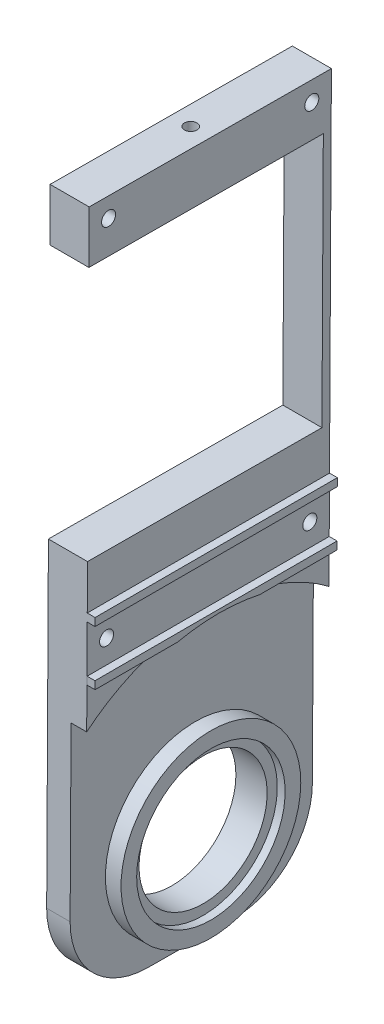
ISO-10303-21;
HEADER;
FILE_DESCRIPTION(('STEP AP214'),'2;1');
FILE_NAME('part.step','',(''),(''),'','','');
FILE_SCHEMA(('AUTOMOTIVE_DESIGN { 1 0 10303 214 1 1 1 1 }'));
ENDSEC;
DATA;
#1=APPLICATION_CONTEXT('core data for automotive mechanical design processes');
#2=APPLICATION_PROTOCOL_DEFINITION('international standard','automotive_design',2000,#1);
#3=PRODUCT_CONTEXT('',#1,'mechanical');
#4=PRODUCT('Part','Part','',(#3));
#5=PRODUCT_RELATED_PRODUCT_CATEGORY('part','',(#4));
#6=PRODUCT_DEFINITION_FORMATION('','',#4);
#7=PRODUCT_DEFINITION_CONTEXT('part definition',#1,'design');
#8=PRODUCT_DEFINITION('design','',#6,#7);
#9=PRODUCT_DEFINITION_SHAPE('','',#8);
#10=(LENGTH_UNIT() NAMED_UNIT(*) SI_UNIT(.MILLI.,.METRE.));
#11=(NAMED_UNIT(*) PLANE_ANGLE_UNIT() SI_UNIT($,.RADIAN.));
#12=(NAMED_UNIT(*) SI_UNIT($,.STERADIAN.) SOLID_ANGLE_UNIT());
#13=UNCERTAINTY_MEASURE_WITH_UNIT(LENGTH_MEASURE(1.E-05),#10,'distance_accuracy_value','');
#14=(GEOMETRIC_REPRESENTATION_CONTEXT(3) GLOBAL_UNCERTAINTY_ASSIGNED_CONTEXT((#13)) GLOBAL_UNIT_ASSIGNED_CONTEXT((#10,
#11,#12)) REPRESENTATION_CONTEXT('',''));
#15=CARTESIAN_POINT('',(0.,0.,0.));
#16=DIRECTION('',(0.,0.,1.));
#17=DIRECTION('',(1.,0.,0.));
#18=AXIS2_PLACEMENT_3D('',#15,#16,#17);
#19=CARTESIAN_POINT('',(-39.4500003051732,-115.077694337789,2.56996746609196));
#20=DIRECTION('',(1.,0.,0.));
#21=DIRECTION('',(0.,-0.00544923737853215,-0.999985152795776));
#22=AXIS2_PLACEMENT_3D('',#19,#20,#21);
#23=PLANE('',#22);
#24=DIRECTION('',(0.,-0.999985152795776,0.00544923737853215));
#25=VECTOR('',#24,1.);
#26=CARTESIAN_POINT('',(-39.4500003051732,-169.486724480372,1.86644474152904));
#27=LINE('',#26,#25);
#28=CARTESIAN_POINT('',(-39.4500003051732,-122.794382024896,1.61200330598548));
#29=VERTEX_POINT('',#28);
#30=CARTESIAN_POINT('',(-39.4500003051732,-127.316414004726,1.63664529754157));
#31=VERTEX_POINT('',#30);
#32=EDGE_CURVE('E336',#29,#31,#27,.T.);
#33=ORIENTED_EDGE('',*,*,#32,.F.);
#34=DIRECTION('',(0.,0.,-1.));
#35=VECTOR('',#34,1.);
#36=CARTESIAN_POINT('',(-39.4500003051732,-122.794382024896,0.));
#37=LINE('',#36,#35);
#38=CARTESIAN_POINT('',(-39.4500003051732,-122.794382024896,11.4836041956586));
#39=VERTEX_POINT('',#38);
#40=EDGE_CURVE('E215',#39,#29,#37,.T.);
#41=ORIENTED_EDGE('',*,*,#40,.F.);
#42=CARTESIAN_POINT('',(-39.4500003051732,-147.234378499964,16.7454073370512));
#43=DIRECTION('',(1.,0.,0.));
#44=DIRECTION('',(0.,-0.00544923737853215,-0.999985152795776));
#45=AXIS2_PLACEMENT_3D('',#42,#43,#44);
#46=CIRCLE('',#45,25.0000000000014);
#47=EDGE_CURVE('E361',#31,#39,#46,.T.);
#48=ORIENTED_EDGE('',*,*,#47,.F.);
#49=EDGE_LOOP('',(#33,#41,#48));
#50=FACE_BOUND('',#49,.T.);
#51=ADVANCED_FACE('F35',(#50),#23,.T.);
#52=CARTESIAN_POINT('',(-39.4500003051732,-72.4284713160586,29.8379665793882));
#53=DIRECTION('',(1.,0.,0.));
#54=DIRECTION('',(0.,-0.00544923737853215,-0.999985152795776));
#55=AXIS2_PLACEMENT_3D('',#52,#53,#54);
#56=CIRCLE('',#55,0.899999999999998);
#57=CARTESIAN_POINT('',(-39.4500003051732,-72.4333756296993,28.937979941872));
#58=VERTEX_POINT('',#57);
#59=EDGE_CURVE('E394',#58,#58,#56,.F.);
#60=ORIENTED_EDGE('',*,*,#59,.T.);
#61=EDGE_LOOP('',(#60));
#62=FACE_BOUND('',#61,.T.);
#63=CARTESIAN_POINT('',(-39.4500003051732,-72.5701514879004,3.838352606698));
#64=DIRECTION('',(1.,0.,0.));
#65=DIRECTION('',(0.,-0.00544923737853215,-0.999985152795776));
#66=AXIS2_PLACEMENT_3D('',#63,#64,#65);
#67=CIRCLE('',#66,0.899999999999998);
#68=CARTESIAN_POINT('',(-39.4500003051732,-72.5750558015411,2.93836596918181));
#69=VERTEX_POINT('',#68);
#70=EDGE_CURVE('E260',#69,#69,#67,.F.);
#71=ORIENTED_EDGE('',*,*,#70,.T.);
#72=EDGE_LOOP('',(#71));
#73=FACE_BOUND('',#72,.T.);
#74=DIRECTION('',(0.,-0.999985152795776,0.00544923737853215));
#75=VECTOR('',#74,1.);
#76=CARTESIAN_POINT('',(-39.4500003051732,-158.913563939447,32.8092884946207));
#77=LINE('',#76,#75);
#78=CARTESIAN_POINT('',(-39.4500003051732,-109.108021230912,32.5378822400112));
#79=VERTEX_POINT('',#78);
#80=CARTESIAN_POINT('',(-39.4500003051732,-114.794382024896,32.5688690298648));
#81=VERTEX_POINT('',#80);
#82=EDGE_CURVE('E299',#79,#81,#77,.T.);
#83=ORIENTED_EDGE('',*,*,#82,.T.);
#84=DIRECTION('',(0.,0.,-1.));
#85=VECTOR('',#84,1.);
#86=CARTESIAN_POINT('',(-39.4500003051732,-114.794382024896,0.));
#87=LINE('',#86,#85);
#88=CARTESIAN_POINT('',(-39.4500003051732,-114.794382024896,1.56840875970009));
#89=VERTEX_POINT('',#88);
#90=EDGE_CURVE('E200',#81,#89,#87,.T.);
#91=ORIENTED_EDGE('',*,*,#90,.T.);
#92=CARTESIAN_POINT('',(-39.4500003051732,-70.0838116993573,1.32476663126224));
#93=VERTEX_POINT('',#92);
#94=EDGE_CURVE('E337',#93,#89,#27,.T.);
#95=ORIENTED_EDGE('',*,*,#94,.F.);
#96=DIRECTION('',(0.,0.00544923737853215,0.999985152795776));
#97=VECTOR('',#96,1.);
#98=CARTESIAN_POINT('',(-39.4500003051732,-69.9148853406228,32.3243063679313));
#99=LINE('',#98,#97);
#100=CARTESIAN_POINT('',(-39.4500003051732,-69.9148853406228,32.3243063679313));
#101=VERTEX_POINT('',#100);
#102=EDGE_CURVE('E391',#93,#101,#99,.T.);
#103=ORIENTED_EDGE('',*,*,#102,.T.);
#104=CARTESIAN_POINT('',(-39.4500003051732,-76.6085037650488,32.3607820252089));
#105=VERTEX_POINT('',#104);
#106=EDGE_CURVE('E295',#101,#105,#77,.T.);
#107=ORIENTED_EDGE('',*,*,#106,.T.);
#108=DIRECTION('',(0.,-0.00544923737853215,-0.999985152795776));
#109=VECTOR('',#108,1.);
#110=CARTESIAN_POINT('',(-39.4500003051732,-76.7719808864048,2.36122744133556));
#111=LINE('',#110,#109);
#112=CARTESIAN_POINT('',(-39.4500003051732,-76.7719808864048,2.36122744133556));
#113=VERTEX_POINT('',#112);
#114=EDGE_CURVE('E311',#105,#113,#111,.T.);
#115=ORIENTED_EDGE('',*,*,#114,.T.);
#116=DIRECTION('',(0.,0.999985152795776,-0.00544923737853215));
#117=VECTOR('',#116,1.);
#118=CARTESIAN_POINT('',(-39.4500003051732,-115.077694337789,2.56996746609196));
#119=LINE('',#118,#117);
#120=CARTESIAN_POINT('',(-39.4500003051732,-109.271498352267,2.53832765613786));
#121=VERTEX_POINT('',#120);
#122=EDGE_CURVE('E264',#121,#113,#119,.T.);
#123=ORIENTED_EDGE('',*,*,#122,.F.);
#124=DIRECTION('',(0.,0.00544923737853209,0.999985152795776));
#125=VECTOR('',#124,1.);
#126=CARTESIAN_POINT('',(-39.4500003051732,-109.271498352267,2.53832765613786));
#127=LINE('',#126,#125);
#128=EDGE_CURVE('E308',#121,#79,#127,.T.);
#129=ORIENTED_EDGE('',*,*,#128,.T.);
#130=EDGE_LOOP('',(#83,#91,#95,#103,#107,#115,#123,#129));
#131=FACE_BOUND('',#130,.T.);
#132=ADVANCED_FACE('F458',(#62,#73,#131),#23,.T.);
#133=DIRECTION('',(0.,0.,-1.));
#134=VECTOR('',#133,1.);
#135=CARTESIAN_POINT('',(-39.4500003051732,-121.794382024896,0.));
#136=LINE('',#135,#134);
#137=CARTESIAN_POINT('',(-39.4500003051732,-121.794382024896,32.5743183481504));
#138=VERTEX_POINT('',#137);
#139=CARTESIAN_POINT('',(-39.4500003051732,-121.794382024896,1.60655398769981));
#140=VERTEX_POINT('',#139);
#141=EDGE_CURVE('E197',#138,#140,#136,.T.);
#142=ORIENTED_EDGE('',*,*,#141,.T.);
#143=CARTESIAN_POINT('',(-39.4500003051732,-115.794382024896,1.57385807798577));
#144=VERTEX_POINT('',#143);
#145=EDGE_CURVE('E341',#144,#140,#27,.T.);
#146=ORIENTED_EDGE('',*,*,#145,.F.);
#147=DIRECTION('',(0.,0.,-1.));
#148=VECTOR('',#147,1.);
#149=CARTESIAN_POINT('',(-39.4500003051732,-115.794382024896,0.));
#150=LINE('',#149,#148);
#151=CARTESIAN_POINT('',(-39.4500003051732,-115.794382024896,32.5743183481504));
#152=VERTEX_POINT('',#151);
#153=EDGE_CURVE('E60',#152,#144,#150,.T.);
#154=ORIENTED_EDGE('',*,*,#153,.F.);
#155=CARTESIAN_POINT('',(-39.4500003051732,-127.938103195085,32.6404933499793));
#156=VERTEX_POINT('',#155);
#157=EDGE_CURVE('E297',#152,#156,#77,.T.);
#158=ORIENTED_EDGE('',*,*,#157,.T.);
#159=CARTESIAN_POINT('',(-39.4500003051732,-122.794382024896,22.0072104784438));
#160=VERTEX_POINT('',#159);
#161=EDGE_CURVE('E353',#160,#156,#46,.T.);
#162=ORIENTED_EDGE('',*,*,#161,.F.);
#163=CARTESIAN_POINT('',(-39.4500003051732,-122.794382024896,32.5688690298648));
#164=VERTEX_POINT('',#163);
#165=EDGE_CURVE('E217',#164,#160,#37,.T.);
#166=ORIENTED_EDGE('',*,*,#165,.F.);
#167=DIRECTION('',(0.,-0.999985152795777,-0.00544923737853177));
#168=VECTOR('',#167,1.);
#169=CARTESIAN_POINT('',(-39.4500003051732,-0.181119142945197,33.2370277253534));
#170=LINE('',#169,#168);
#171=EDGE_CURVE('E227',#138,#164,#170,.T.);
#172=ORIENTED_EDGE('',*,*,#171,.F.);
#173=EDGE_LOOP('',(#142,#146,#154,#158,#162,#166,#172));
#174=FACE_BOUND('',#173,.T.);
#175=CARTESIAN_POINT('',(-39.4500003051732,-118.936062196738,4.0910152117556));
#176=DIRECTION('',(1.,0.,0.));
#177=DIRECTION('',(0.,-0.00544923737853215,-0.999985152795776));
#178=AXIS2_PLACEMENT_3D('',#175,#176,#177);
#179=CIRCLE('',#178,0.899999999999998);
#180=CARTESIAN_POINT('',(-39.4500003051732,-118.940966510379,3.1910285742394));
#181=VERTEX_POINT('',#180);
#182=EDGE_CURVE('E397',#181,#181,#179,.F.);
#183=ORIENTED_EDGE('',*,*,#182,.T.);
#184=EDGE_LOOP('',(#183));
#185=FACE_BOUND('',#184,.T.);
#186=CARTESIAN_POINT('',(-39.4500003051732,-118.794382024896,30.0906291844458));
#187=DIRECTION('',(1.,0.,0.));
#188=DIRECTION('',(0.,-0.00544923737853215,-0.999985152795776));
#189=AXIS2_PLACEMENT_3D('',#186,#187,#188);
#190=CIRCLE('',#189,0.899999999999998);
#191=CARTESIAN_POINT('',(-39.4500003051732,-118.799286338537,29.1906425469296));
#192=VERTEX_POINT('',#191);
#193=EDGE_CURVE('E400',#192,#192,#190,.F.);
#194=ORIENTED_EDGE('',*,*,#193,.T.);
#195=EDGE_LOOP('',(#194));
#196=FACE_BOUND('',#195,.T.);
#197=ADVANCED_FACE('F492',(#174,#185,#196),#23,.T.);
#198=CARTESIAN_POINT('',(-41.9500003051732,-74.9992742839689,16.8517826864894));
#199=DIRECTION('',(0.,0.999985152795776,-0.00544923737853215));
#200=DIRECTION('',(0.,0.00544923737853215,0.999985152795776));
#201=AXIS2_PLACEMENT_3D('',#198,#199,#200);
#202=CONICAL_SURFACE('',#201,0.800000000000002,1.02974425867665);
#203=CARTESIAN_POINT('',(-41.9500003051732,-75.4799556423107,16.854402072205));
#204=VERTEX_POINT('',#203);
#205=VERTEX_LOOP('',#204);
#206=FACE_BOUND('',#205,.T.);
#207=CARTESIAN_POINT('',(-41.9500003051732,-74.9992742839689,16.8517826864894));
#208=DIRECTION('',(0.,0.999985152795776,-0.00544923737853215));
#209=DIRECTION('',(0.,0.00544923737853215,0.999985152795776));
#210=AXIS2_PLACEMENT_3D('',#207,#208,#209);
#211=CIRCLE('',#210,0.800000000000002);
#212=CARTESIAN_POINT('',(-41.9500003051732,-74.9949148940661,17.6517708087261));
#213=VERTEX_POINT('',#212);
#214=EDGE_CURVE('E357',#213,#213,#211,.T.);
#215=ORIENTED_EDGE('',*,*,#214,.T.);
#216=EDGE_LOOP('',(#215));
#217=FACE_BOUND('',#216,.T.);
#218=ADVANCED_FACE('F497',(#206,#217),#202,.F.);
#219=CARTESIAN_POINT('',(27.5499996948268,-147.234378499964,16.7454073370512));
#220=DIRECTION('',(-1.,0.,0.));
#221=DIRECTION('',(0.,0.00544923737853215,0.999985152795776));
#222=AXIS2_PLACEMENT_3D('',#219,#220,#221);
#223=CYLINDRICAL_SURFACE('',#222,8.19999999999859);
#224=CARTESIAN_POINT('',(-40.4500003051732,-147.234378499964,16.7454073370512));
#225=DIRECTION('',(-1.,0.,0.));
#226=DIRECTION('',(0.,0.00544923737853215,0.999985152795776));
#227=AXIS2_PLACEMENT_3D('',#224,#225,#226);
#228=CIRCLE('',#227,8.19999999999859);
#229=CARTESIAN_POINT('',(-40.4500003051732,-147.18969475346,24.9452855899752));
#230=VERTEX_POINT('',#229);
#231=EDGE_CURVE('E331',#230,#230,#228,.T.);
#232=ORIENTED_EDGE('',*,*,#231,.F.);
#233=EDGE_LOOP('',(#232));
#234=FACE_BOUND('',#233,.T.);
#235=CARTESIAN_POINT('',(-44.4500003051732,-147.234378499964,16.7454073370512));
#236=DIRECTION('',(1.,0.,0.));
#237=DIRECTION('',(0.,-0.00544923737853215,-0.999985152795776));
#238=AXIS2_PLACEMENT_3D('',#235,#236,#237);
#239=CIRCLE('',#238,8.19999999999859);
#240=CARTESIAN_POINT('',(-44.4500003051732,-147.279062246468,8.54552908412724));
#241=VERTEX_POINT('',#240);
#242=EDGE_CURVE('E320',#241,#241,#239,.F.);
#243=ORIENTED_EDGE('',*,*,#242,.T.);
#244=EDGE_LOOP('',(#243));
#245=FACE_BOUND('',#244,.T.);
#246=ADVANCED_FACE('F505',(#234,#245),#223,.F.);
#247=CARTESIAN_POINT('',(-44.4500003051732,-159.913549092243,32.8147377319992));
#248=DIRECTION('',(0.,0.999985152795776,-0.00544923737853215));
#249=DIRECTION('',(-1.,0.,0.));
#250=AXIS2_PLACEMENT_3D('',#247,#248,#249);
#251=PLANE('',#250);
#252=DIRECTION('',(0.,-0.00544923737853215,-0.999985152795776));
#253=VECTOR('',#252,1.);
#254=CARTESIAN_POINT('',(-44.4500003051732,-159.913549092243,32.8147377319992));
#255=LINE('',#254,#253);
#256=CARTESIAN_POINT('',(-44.4500003051732,-159.968041466028,22.8148862040414));
#257=VERTEX_POINT('',#256);
#258=CARTESIAN_POINT('',(-44.4500003051732,-160.027983077192,11.8150495232879));
#259=VERTEX_POINT('',#258);
#260=EDGE_CURVE('E288',#257,#259,#255,.T.);
#261=ORIENTED_EDGE('',*,*,#260,.T.);
#262=DIRECTION('',(1.,0.,0.));
#263=VECTOR('',#262,1.);
#264=CARTESIAN_POINT('',(-44.4500003051732,-160.027983077192,11.8150495232879));
#265=LINE('',#264,#263);
#266=CARTESIAN_POINT('',(-41.4500003051732,-160.027983077192,11.8150495232879));
#267=VERTEX_POINT('',#266);
#268=EDGE_CURVE('E270',#259,#267,#265,.T.);
#269=ORIENTED_EDGE('',*,*,#268,.T.);
#270=DIRECTION('',(0.,-0.00544923737853215,-0.999985152795776));
#271=VECTOR('',#270,1.);
#272=CARTESIAN_POINT('',(-41.4500003051732,-159.913549092243,32.8147377319992));
#273=LINE('',#272,#271);
#274=CARTESIAN_POINT('',(-41.4500003051732,-159.968041466028,22.8148862040414));
#275=VERTEX_POINT('',#274);
#276=EDGE_CURVE('E347',#275,#267,#273,.T.);
#277=ORIENTED_EDGE('',*,*,#276,.F.);
#278=DIRECTION('',(1.,0.,0.));
#279=VECTOR('',#278,1.);
#280=CARTESIAN_POINT('',(-44.4500003051732,-159.968041466028,22.8148862040414));
#281=LINE('',#280,#279);
#282=EDGE_CURVE('E273',#275,#257,#281,.F.);
#283=ORIENTED_EDGE('',*,*,#282,.T.);
#284=EDGE_LOOP('',(#261,#269,#277,#283));
#285=FACE_BOUND('',#284,.T.);
#286=ADVANCED_FACE('F424',(#285),#251,.F.);
#287=CARTESIAN_POINT('',(-44.4500003051732,-150.028131549234,11.7605571495026));
#288=DIRECTION('',(1.,0.,0.));
#289=DIRECTION('',(0.,0.999985152795776,-0.00544923737853215));
#290=AXIS2_PLACEMENT_3D('',#287,#288,#289);
#291=CYLINDRICAL_SURFACE('',#290,10.);
#292=CARTESIAN_POINT('',(-44.4500003051732,-150.028131549234,11.7605571495026));
#293=DIRECTION('',(1.,0.,0.));
#294=DIRECTION('',(0.,-0.00544923737853215,-0.999985152795776));
#295=AXIS2_PLACEMENT_3D('',#292,#293,#294);
#296=CIRCLE('',#295,10.);
#297=CARTESIAN_POINT('',(-44.4500003051732,-150.082623923019,1.76070562154481));
#298=VERTEX_POINT('',#297);
#299=EDGE_CURVE('E261',#298,#259,#296,.F.);
#300=ORIENTED_EDGE('',*,*,#299,.F.);
#301=DIRECTION('',(1.,0.,0.));
#302=VECTOR('',#301,1.);
#303=CARTESIAN_POINT('',(-8.45000030517323,-150.082623923019,1.76070562154481));
#304=LINE('',#303,#302);
#305=CARTESIAN_POINT('',(-41.4500003051732,-150.082623923019,1.76070562154481));
#306=VERTEX_POINT('',#305);
#307=EDGE_CURVE('E275',#306,#298,#304,.F.);
#308=ORIENTED_EDGE('',*,*,#307,.F.);
#309=CARTESIAN_POINT('',(-41.4500003051732,-150.028131549234,11.7605571495026));
#310=DIRECTION('',(1.,0.,0.));
#311=DIRECTION('',(0.,-0.00544923737853215,-0.999985152795776));
#312=AXIS2_PLACEMENT_3D('',#309,#310,#311);
#313=CIRCLE('',#312,10.);
#314=EDGE_CURVE('E266',#267,#306,#313,.T.);
#315=ORIENTED_EDGE('',*,*,#314,.F.);
#316=ORIENTED_EDGE('',*,*,#268,.F.);
#317=EDGE_LOOP('',(#300,#308,#315,#316));
#318=FACE_BOUND('',#317,.T.);
#319=ADVANCED_FACE('F429',(#318),#291,.T.);
#320=CARTESIAN_POINT('',(-8.45000030517323,-149.96818993807,22.7603938302561));
#321=DIRECTION('',(1.,0.,0.));
#322=DIRECTION('',(0.,0.999985152795776,-0.00544923737853215));
#323=AXIS2_PLACEMENT_3D('',#320,#321,#322);
#324=CYLINDRICAL_SURFACE('',#323,10.);
#325=CARTESIAN_POINT('',(-44.4500003051732,-149.96818993807,22.7603938302561));
#326=DIRECTION('',(1.,0.,0.));
#327=DIRECTION('',(0.,-0.00544923737853215,-0.999985152795776));
#328=AXIS2_PLACEMENT_3D('',#325,#326,#327);
#329=CIRCLE('',#328,10.);
#330=CARTESIAN_POINT('',(-44.4500003051732,-149.913697564285,32.7602453582139));
#331=VERTEX_POINT('',#330);
#332=EDGE_CURVE('E263',#257,#331,#329,.F.);
#333=ORIENTED_EDGE('',*,*,#332,.F.);
#334=ORIENTED_EDGE('',*,*,#282,.F.);
#335=CARTESIAN_POINT('',(-41.4500003051732,-149.96818993807,22.7603938302561));
#336=DIRECTION('',(1.,0.,0.));
#337=DIRECTION('',(0.,-0.00544923737853215,-0.999985152795776));
#338=AXIS2_PLACEMENT_3D('',#335,#336,#337);
#339=CIRCLE('',#338,10.);
#340=CARTESIAN_POINT('',(-41.4500003051732,-149.913697564285,32.7602453582139));
#341=VERTEX_POINT('',#340);
#342=EDGE_CURVE('E268',#341,#275,#339,.T.);
#343=ORIENTED_EDGE('',*,*,#342,.F.);
#344=DIRECTION('',(1.,0.,0.));
#345=VECTOR('',#344,1.);
#346=CARTESIAN_POINT('',(-8.45000030517323,-149.913697564285,32.7602453582139));
#347=LINE('',#346,#345);
#348=EDGE_CURVE('E277',#331,#341,#347,.T.);
#349=ORIENTED_EDGE('',*,*,#348,.F.);
#350=EDGE_LOOP('',(#333,#334,#343,#349));
#351=FACE_BOUND('',#350,.T.);
#352=ADVANCED_FACE('F418',(#351),#324,.T.);
#353=CARTESIAN_POINT('',(-8.45000030517323,-114.914217216433,32.5695220499653));
#354=DIRECTION('',(0.,-0.00544923737853215,-0.999985152795776));
#355=DIRECTION('',(-1.,0.,0.));
#356=AXIS2_PLACEMENT_3D('',#353,#354,#355);
#357=PLANE('',#356);
#358=ORIENTED_EDGE('',*,*,#82,.F.);
#359=DIRECTION('',(-1.,0.,0.));
#360=VECTOR('',#359,1.);
#361=CARTESIAN_POINT('',(4.7795147272121,-109.108021230912,32.5378822400112));
#362=LINE('',#361,#360);
#363=CARTESIAN_POINT('',(-44.4500003051732,-109.108021230912,32.5378822400112));
#364=VERTEX_POINT('',#363);
#365=EDGE_CURVE('E305',#79,#364,#362,.T.);
#366=ORIENTED_EDGE('',*,*,#365,.T.);
#367=DIRECTION('',(0.,-0.999985152795776,0.00544923737853215));
#368=VECTOR('',#367,1.);
#369=CARTESIAN_POINT('',(-44.4500003051732,-159.913549092243,32.8147377319992));
#370=LINE('',#369,#368);
#371=EDGE_CURVE('E294',#364,#331,#370,.T.);
#372=ORIENTED_EDGE('',*,*,#371,.T.);
#373=ORIENTED_EDGE('',*,*,#348,.T.);
#374=DIRECTION('',(0.,-0.999985152795776,0.00544923737853215));
#375=VECTOR('',#374,1.);
#376=CARTESIAN_POINT('',(-41.4500003051732,-114.914217216433,32.5695220499653));
#377=LINE('',#376,#375);
#378=CARTESIAN_POINT('',(-41.4500003051732,-127.938103195085,32.6404933499793));
#379=VERTEX_POINT('',#378);
#380=EDGE_CURVE('E344',#379,#341,#377,.T.);
#381=ORIENTED_EDGE('',*,*,#380,.F.);
#382=DIRECTION('',(1.,0.,0.));
#383=VECTOR('',#382,1.);
#384=CARTESIAN_POINT('',(-41.4500003051732,-127.938103195085,32.6404933499793));
#385=LINE('',#384,#383);
#386=EDGE_CURVE('E340',#379,#156,#385,.T.);
#387=ORIENTED_EDGE('',*,*,#386,.T.);
#388=ORIENTED_EDGE('',*,*,#157,.F.);
#389=DIRECTION('',(-1.,0.,0.));
#390=VECTOR('',#389,1.);
#391=CARTESIAN_POINT('',(-38.4500003051732,-115.794382024896,32.5743183481504));
#392=LINE('',#391,#390);
#393=CARTESIAN_POINT('',(-38.4500003051732,-115.794382024896,32.5743183481504));
#394=VERTEX_POINT('',#393);
#395=EDGE_CURVE('E254',#394,#152,#392,.T.);
#396=ORIENTED_EDGE('',*,*,#395,.F.);
#397=DIRECTION('',(0.,-0.999985152795777,0.00544923737853215));
#398=VECTOR('',#397,1.);
#399=CARTESIAN_POINT('',(-38.4500003051732,0.174064137517024,31.9423693739164));
#400=LINE('',#399,#398);
#401=CARTESIAN_POINT('',(-38.4500003051732,-114.794382024896,32.5688690298648));
#402=VERTEX_POINT('',#401);
#403=EDGE_CURVE('E240',#402,#394,#400,.T.);
#404=ORIENTED_EDGE('',*,*,#403,.F.);
#405=DIRECTION('',(-1.,0.,0.));
#406=VECTOR('',#405,1.);
#407=CARTESIAN_POINT('',(-38.4500003051732,-114.794382024896,32.5688690298648));
#408=LINE('',#407,#406);
#409=EDGE_CURVE('E257',#402,#81,#408,.T.);
#410=ORIENTED_EDGE('',*,*,#409,.T.);
#411=EDGE_LOOP('',(#358,#366,#372,#373,#381,#387,#388,#396,#404,#410));
#412=FACE_BOUND('',#411,.T.);
#413=ADVANCED_FACE('F411',(#412),#357,.F.);
#414=CARTESIAN_POINT('',(-8.45000030517323,-115.083143575167,1.56998231329618));
#415=DIRECTION('',(0.,0.00544923737853215,0.999985152795776));
#416=DIRECTION('',(1.,0.,0.));
#417=AXIS2_PLACEMENT_3D('',#414,#415,#416);
#418=PLANE('',#417);
#419=DIRECTION('',(1.,0.,0.));
#420=VECTOR('',#419,1.);
#421=CARTESIAN_POINT('',(-8.45000030517323,-70.0838116993573,1.32476663126224));
#422=LINE('',#421,#420);
#423=CARTESIAN_POINT('',(-44.4500003051732,-70.0838116993573,1.32476663126224));
#424=VERTEX_POINT('',#423);
#425=EDGE_CURVE('E39',#424,#93,#422,.T.);
#426=ORIENTED_EDGE('',*,*,#425,.T.);
#427=ORIENTED_EDGE('',*,*,#94,.T.);
#428=DIRECTION('',(-1.,0.,0.));
#429=VECTOR('',#428,1.);
#430=CARTESIAN_POINT('',(-38.4500003051732,-114.794382024896,1.56840875970009));
#431=LINE('',#430,#429);
#432=CARTESIAN_POINT('',(-38.4500003051732,-114.794382024896,1.56840875970009));
#433=VERTEX_POINT('',#432);
#434=EDGE_CURVE('E246',#433,#89,#431,.T.);
#435=ORIENTED_EDGE('',*,*,#434,.F.);
#436=DIRECTION('',(0.,0.999985152795777,-0.00544923737853215));
#437=VECTOR('',#436,1.);
#438=CARTESIAN_POINT('',(-38.4500003051732,0.00513777878252704,0.942829637247357));
#439=LINE('',#438,#437);
#440=CARTESIAN_POINT('',(-38.4500003051732,-115.794382024896,1.57385807798577));
#441=VERTEX_POINT('',#440);
#442=EDGE_CURVE('E244',#441,#433,#439,.T.);
#443=ORIENTED_EDGE('',*,*,#442,.F.);
#444=DIRECTION('',(-1.,0.,0.));
#445=VECTOR('',#444,1.);
#446=CARTESIAN_POINT('',(-38.4500003051732,-115.794382024896,1.57385807798577));
#447=LINE('',#446,#445);
#448=EDGE_CURVE('E251',#441,#144,#447,.T.);
#449=ORIENTED_EDGE('',*,*,#448,.T.);
#450=ORIENTED_EDGE('',*,*,#145,.T.);
#451=DIRECTION('',(-1.,0.,0.));
#452=VECTOR('',#451,1.);
#453=CARTESIAN_POINT('',(-38.4500003051732,-121.794382024896,1.60655398769981));
#454=LINE('',#453,#452);
#455=CARTESIAN_POINT('',(-38.4500003051732,-121.794382024896,1.60655398769981));
#456=VERTEX_POINT('',#455);
#457=EDGE_CURVE('E225',#456,#140,#454,.T.);
#458=ORIENTED_EDGE('',*,*,#457,.F.);
#459=DIRECTION('',(0.,0.999985152795777,-0.00544923737853215));
#460=VECTOR('',#459,1.);
#461=CARTESIAN_POINT('',(-38.4500003051732,0.00513777878252704,0.942829637247357));
#462=LINE('',#461,#460);
#463=CARTESIAN_POINT('',(-38.4500003051732,-122.794382024896,1.61200330598548));
#464=VERTEX_POINT('',#463);
#465=EDGE_CURVE('E213',#464,#456,#462,.T.);
#466=ORIENTED_EDGE('',*,*,#465,.F.);
#467=DIRECTION('',(-1.,0.,0.));
#468=VECTOR('',#467,1.);
#469=CARTESIAN_POINT('',(-38.4500003051732,-122.794382024896,1.61200330598548));
#470=LINE('',#469,#468);
#471=EDGE_CURVE('E230',#464,#29,#470,.T.);
#472=ORIENTED_EDGE('',*,*,#471,.T.);
#473=ORIENTED_EDGE('',*,*,#32,.T.);
#474=DIRECTION('',(1.,0.,0.));
#475=VECTOR('',#474,1.);
#476=CARTESIAN_POINT('',(-41.4500003051732,-127.316414004726,1.63664529754157));
#477=LINE('',#476,#475);
#478=CARTESIAN_POINT('',(-41.4500003051732,-127.316414004726,1.63664529754157));
#479=VERTEX_POINT('',#478);
#480=EDGE_CURVE('E280',#31,#479,#477,.F.);
#481=ORIENTED_EDGE('',*,*,#480,.T.);
#482=DIRECTION('',(0.,0.999985152795776,-0.00544923737853215));
#483=VECTOR('',#482,1.);
#484=CARTESIAN_POINT('',(-41.4500003051732,-115.083143575167,1.56998231329618));
#485=LINE('',#484,#483);
#486=EDGE_CURVE('E283',#306,#479,#485,.T.);
#487=ORIENTED_EDGE('',*,*,#486,.F.);
#488=ORIENTED_EDGE('',*,*,#307,.T.);
#489=DIRECTION('',(0.,0.999985152795776,-0.00544923737853215));
#490=VECTOR('',#489,1.);
#491=CARTESIAN_POINT('',(-44.4500003051732,-115.083143575167,1.56998231329618));
#492=LINE('',#491,#490);
#493=EDGE_CURVE('E300',#298,#424,#492,.T.);
#494=ORIENTED_EDGE('',*,*,#493,.T.);
#495=EDGE_LOOP('',(#426,#427,#435,#443,#449,#450,#458,#466,#472,#473,#481,#487,#488,#494));
#496=FACE_BOUND('',#495,.T.);
#497=ADVANCED_FACE('F435',(#496),#418,.F.);
#498=CARTESIAN_POINT('',(-41.4500003051732,-147.234378499964,16.7454073370512));
#499=DIRECTION('',(1.,0.,0.));
#500=DIRECTION('',(0.,-0.00544923737853215,-0.999985152795776));
#501=AXIS2_PLACEMENT_3D('',#498,#499,#500);
#502=PLANE('',#501);
#503=CARTESIAN_POINT('',(-41.4500003051732,-147.234378499964,16.7454073370512));
#504=DIRECTION('',(1.,0.,0.));
#505=DIRECTION('',(0.,-0.00544923737853215,-0.999985152795776));
#506=AXIS2_PLACEMENT_3D('',#503,#504,#505);
#507=CIRCLE('',#506,11.5000000000014);
#508=CARTESIAN_POINT('',(-41.4500003051732,-147.297044729817,5.24557807989836));
#509=VERTEX_POINT('',#508);
#510=EDGE_CURVE('E358',#509,#509,#507,.T.);
#511=ORIENTED_EDGE('',*,*,#510,.F.);
#512=EDGE_LOOP('',(#511));
#513=FACE_BOUND('',#512,.T.);
#514=ORIENTED_EDGE('',*,*,#276,.T.);
#515=ORIENTED_EDGE('',*,*,#314,.T.);
#516=ORIENTED_EDGE('',*,*,#486,.T.);
#517=CARTESIAN_POINT('',(-41.4500003051732,-147.234378499964,16.7454073370512));
#518=DIRECTION('',(1.,0.,0.));
#519=DIRECTION('',(0.,-0.00544923737853215,-0.999985152795776));
#520=AXIS2_PLACEMENT_3D('',#517,#518,#519);
#521=CIRCLE('',#520,25.0000000000014);
#522=EDGE_CURVE('E350',#479,#379,#521,.T.);
#523=ORIENTED_EDGE('',*,*,#522,.T.);
#524=ORIENTED_EDGE('',*,*,#380,.T.);
#525=ORIENTED_EDGE('',*,*,#342,.T.);
#526=EDGE_LOOP('',(#514,#515,#516,#523,#524,#525));
#527=FACE_BOUND('',#526,.T.);
#528=ADVANCED_FACE('F422',(#513,#527),#502,.T.);
#529=CARTESIAN_POINT('',(-41.4500003051732,-147.234378499964,16.7454073370512));
#530=DIRECTION('',(1.,0.,0.));
#531=DIRECTION('',(0.,-0.00544923737853215,-0.999985152795776));
#532=AXIS2_PLACEMENT_3D('',#529,#530,#531);
#533=CYLINDRICAL_SURFACE('',#532,25.0000000000014);
#534=ORIENTED_EDGE('',*,*,#522,.F.);
#535=ORIENTED_EDGE('',*,*,#480,.F.);
#536=ORIENTED_EDGE('',*,*,#47,.T.);
#537=DIRECTION('',(-1.,0.,0.));
#538=VECTOR('',#537,1.);
#539=CARTESIAN_POINT('',(-38.4500003051732,-122.794382024896,11.4836041956586));
#540=LINE('',#539,#538);
#541=CARTESIAN_POINT('',(-38.4500003051732,-122.794382024896,11.4836041956586));
#542=VERTEX_POINT('',#541);
#543=EDGE_CURVE('E233',#542,#39,#540,.T.);
#544=ORIENTED_EDGE('',*,*,#543,.F.);
#545=CARTESIAN_POINT('',(-38.4500003051732,-147.234378499964,16.7454073370512));
#546=DIRECTION('',(1.,0.,0.));
#547=DIRECTION('',(0.,0.,-1.));
#548=AXIS2_PLACEMENT_3D('',#545,#546,#547);
#549=CIRCLE('',#548,25.0000000000014);
#550=CARTESIAN_POINT('',(-38.4500003051732,-122.794382024896,22.0072104784438));
#551=VERTEX_POINT('',#550);
#552=EDGE_CURVE('E221',#551,#542,#549,.F.);
#553=ORIENTED_EDGE('',*,*,#552,.F.);
#554=DIRECTION('',(-1.,0.,0.));
#555=VECTOR('',#554,1.);
#556=CARTESIAN_POINT('',(-38.4500003051732,-122.794382024896,22.0072104784438));
#557=LINE('',#556,#555);
#558=EDGE_CURVE('E52',#551,#160,#557,.T.);
#559=ORIENTED_EDGE('',*,*,#558,.T.);
#560=ORIENTED_EDGE('',*,*,#161,.T.);
#561=ORIENTED_EDGE('',*,*,#386,.F.);
#562=EDGE_LOOP('',(#534,#535,#536,#544,#553,#559,#560,#561));
#563=FACE_BOUND('',#562,.T.);
#564=ADVANCED_FACE('F440',(#563),#533,.F.);
#565=CARTESIAN_POINT('',(-8.45000030517323,-115.077694337789,2.56996746609196));
#566=DIRECTION('',(0.,0.00544923737853215,0.999985152795776));
#567=DIRECTION('',(1.,0.,0.));
#568=AXIS2_PLACEMENT_3D('',#565,#566,#567);
#569=PLANE('',#568);
#570=DIRECTION('',(-1.,0.,0.));
#571=VECTOR('',#570,1.);
#572=CARTESIAN_POINT('',(4.7795147272121,-109.271498352267,2.53832765613786));
#573=LINE('',#572,#571);
#574=CARTESIAN_POINT('',(-44.4500003051732,-109.271498352267,2.53832765613786));
#575=VERTEX_POINT('',#574);
#576=EDGE_CURVE('E302',#121,#575,#573,.T.);
#577=ORIENTED_EDGE('',*,*,#576,.F.);
#578=ORIENTED_EDGE('',*,*,#122,.T.);
#579=DIRECTION('',(-1.,0.,0.));
#580=VECTOR('',#579,1.);
#581=CARTESIAN_POINT('',(4.7795147272121,-76.7719808864048,2.36122744133556));
#582=LINE('',#581,#580);
#583=CARTESIAN_POINT('',(-44.4500003051732,-76.7719808864048,2.36122744133556));
#584=VERTEX_POINT('',#583);
#585=EDGE_CURVE('E304',#113,#584,#582,.T.);
#586=ORIENTED_EDGE('',*,*,#585,.T.);
#587=DIRECTION('',(0.,-0.999985152795776,0.00544923737853227));
#588=VECTOR('',#587,1.);
#589=CARTESIAN_POINT('',(-44.4500003051732,-76.7719808864048,2.36122744133556));
#590=LINE('',#589,#588);
#591=EDGE_CURVE('E317',#584,#575,#590,.T.);
#592=ORIENTED_EDGE('',*,*,#591,.T.);
#593=EDGE_LOOP('',(#577,#578,#586,#592));
#594=FACE_BOUND('',#593,.T.);
#595=ADVANCED_FACE('F475',(#594),#569,.T.);
#596=CARTESIAN_POINT('',(-44.4500003051732,-159.913549092243,32.8147377319992));
#597=DIRECTION('',(1.,0.,0.));
#598=DIRECTION('',(0.,-0.00544923737853215,-0.999985152795776));
#599=AXIS2_PLACEMENT_3D('',#596,#597,#598);
#600=PLANE('',#599);
#601=CARTESIAN_POINT('',(-44.4500003051732,-72.5701514879004,3.838352606698));
#602=DIRECTION('',(-1.,0.,0.));
#603=DIRECTION('',(0.,0.00544923737853215,0.999985152795776));
#604=AXIS2_PLACEMENT_3D('',#601,#602,#603);
#605=CIRCLE('',#604,2.2);
#606=CARTESIAN_POINT('',(-44.4500003051732,-72.5581631656676,6.03831994284871));
#607=VERTEX_POINT('',#606);
#608=EDGE_CURVE('E11',#607,#607,#605,.T.);
#609=ORIENTED_EDGE('',*,*,#608,.F.);
#610=EDGE_LOOP('',(#609));
#611=FACE_BOUND('',#610,.T.);
#612=CARTESIAN_POINT('',(-44.4500003051732,-118.794382024896,30.0906291844458));
#613=DIRECTION('',(-1.,0.,0.));
#614=DIRECTION('',(0.,0.00544923737853215,0.999985152795776));
#615=AXIS2_PLACEMENT_3D('',#612,#613,#614);
#616=CIRCLE('',#615,2.2);
#617=CARTESIAN_POINT('',(-44.4500003051732,-118.782393702664,32.2905965205965));
#618=VERTEX_POINT('',#617);
#619=EDGE_CURVE('E382',#618,#618,#616,.T.);
#620=ORIENTED_EDGE('',*,*,#619,.F.);
#621=EDGE_LOOP('',(#620));
#622=FACE_BOUND('',#621,.T.);
#623=CARTESIAN_POINT('',(-44.4500003051732,-118.936062196738,4.0910152117556));
#624=DIRECTION('',(-1.,0.,0.));
#625=DIRECTION('',(0.,0.00544923737853215,0.999985152795776));
#626=AXIS2_PLACEMENT_3D('',#623,#624,#625);
#627=CIRCLE('',#626,2.2);
#628=CARTESIAN_POINT('',(-44.4500003051732,-118.924073874506,6.2909825479063));
#629=VERTEX_POINT('',#628);
#630=EDGE_CURVE('E376',#629,#629,#627,.T.);
#631=ORIENTED_EDGE('',*,*,#630,.F.);
#632=EDGE_LOOP('',(#631));
#633=FACE_BOUND('',#632,.T.);
#634=CARTESIAN_POINT('',(-44.4500003051732,-72.4284713160586,29.8379665793882));
#635=DIRECTION('',(-1.,0.,0.));
#636=DIRECTION('',(0.,0.00544923737853215,0.999985152795776));
#637=AXIS2_PLACEMENT_3D('',#634,#635,#636);
#638=CIRCLE('',#637,2.2);
#639=CARTESIAN_POINT('',(-44.4500003051732,-72.4164829938258,32.0379339155389));
#640=VERTEX_POINT('',#639);
#641=EDGE_CURVE('E370',#640,#640,#638,.T.);
#642=ORIENTED_EDGE('',*,*,#641,.F.);
#643=EDGE_LOOP('',(#642));
#644=FACE_BOUND('',#643,.T.);
#645=ORIENTED_EDGE('',*,*,#242,.F.);
#646=EDGE_LOOP('',(#645));
#647=FACE_BOUND('',#646,.T.);
#648=ORIENTED_EDGE('',*,*,#493,.F.);
#649=ORIENTED_EDGE('',*,*,#299,.T.);
#650=ORIENTED_EDGE('',*,*,#260,.F.);
#651=ORIENTED_EDGE('',*,*,#332,.T.);
#652=ORIENTED_EDGE('',*,*,#371,.F.);
#653=DIRECTION('',(0.,0.00544923737853209,0.999985152795776));
#654=VECTOR('',#653,1.);
#655=CARTESIAN_POINT('',(-44.4500003051732,-109.271498352267,2.53832765613786));
#656=LINE('',#655,#654);
#657=EDGE_CURVE('E321',#575,#364,#656,.T.);
#658=ORIENTED_EDGE('',*,*,#657,.F.);
#659=ORIENTED_EDGE('',*,*,#591,.F.);
#660=DIRECTION('',(0.,-0.00544923737853215,-0.999985152795776));
#661=VECTOR('',#660,1.);
#662=CARTESIAN_POINT('',(-44.4500003051732,-76.7719808864048,2.36122744133556));
#663=LINE('',#662,#661);
#664=CARTESIAN_POINT('',(-44.4500003051732,-76.6085037650488,32.3607820252089));
#665=VERTEX_POINT('',#664);
#666=EDGE_CURVE('E316',#665,#584,#663,.T.);
#667=ORIENTED_EDGE('',*,*,#666,.F.);
#668=CARTESIAN_POINT('',(-44.4500003051732,-69.9148853406228,32.3243063679313));
#669=VERTEX_POINT('',#668);
#670=EDGE_CURVE('E291',#669,#665,#370,.T.);
#671=ORIENTED_EDGE('',*,*,#670,.F.);
#672=DIRECTION('',(0.,-0.00544923737853215,-0.999985152795776));
#673=VECTOR('',#672,1.);
#674=CARTESIAN_POINT('',(-44.4500003051732,-69.9148853406228,32.3243063679313));
#675=LINE('',#674,#673);
#676=EDGE_CURVE('E285',#669,#424,#675,.T.);
#677=ORIENTED_EDGE('',*,*,#676,.T.);
#678=EDGE_LOOP('',(#648,#649,#650,#651,#652,#658,#659,#667,#671,#677));
#679=FACE_BOUND('',#678,.T.);
#680=ADVANCED_FACE('F471',(#611,#622,#633,#644,#647,#679),#600,.F.);
#681=ORIENTED_EDGE('',*,*,#106,.F.);
#682=DIRECTION('',(-1.,0.,0.));
#683=VECTOR('',#682,1.);
#684=CARTESIAN_POINT('',(-44.4500003051732,-69.9148853406228,32.3243063679313));
#685=LINE('',#684,#683);
#686=EDGE_CURVE('E298',#101,#669,#685,.T.);
#687=ORIENTED_EDGE('',*,*,#686,.T.);
#688=ORIENTED_EDGE('',*,*,#670,.T.);
#689=DIRECTION('',(-1.,0.,0.));
#690=VECTOR('',#689,1.);
#691=CARTESIAN_POINT('',(4.7795147272121,-76.6085037650488,32.3607820252089));
#692=LINE('',#691,#690);
#693=EDGE_CURVE('E309',#105,#665,#692,.T.);
#694=ORIENTED_EDGE('',*,*,#693,.F.);
#695=EDGE_LOOP('',(#681,#687,#688,#694));
#696=FACE_BOUND('',#695,.T.);
#697=ADVANCED_FACE('F469',(#696),#357,.F.);
#698=CARTESIAN_POINT('',(4.7795147272121,-76.7719808864048,2.36122744133556));
#699=DIRECTION('',(0.,0.999985152795776,-0.00544923737853215));
#700=DIRECTION('',(0.,0.00544923737853215,0.999985152795776));
#701=AXIS2_PLACEMENT_3D('',#698,#699,#700);
#702=PLANE('',#701);
#703=ORIENTED_EDGE('',*,*,#693,.T.);
#704=ORIENTED_EDGE('',*,*,#666,.T.);
#705=ORIENTED_EDGE('',*,*,#585,.F.);
#706=ORIENTED_EDGE('',*,*,#114,.F.);
#707=EDGE_LOOP('',(#703,#704,#705,#706));
#708=FACE_BOUND('',#707,.T.);
#709=ADVANCED_FACE('F467',(#708),#702,.F.);
#710=CARTESIAN_POINT('',(4.7795147272121,-109.271498352267,2.53832765613786));
#711=DIRECTION('',(0.,-0.999985152795776,0.00544923737853209));
#712=DIRECTION('',(0.,-0.00544923737853209,-0.999985152795776));
#713=AXIS2_PLACEMENT_3D('',#710,#711,#712);
#714=PLANE('',#713);
#715=ORIENTED_EDGE('',*,*,#576,.T.);
#716=ORIENTED_EDGE('',*,*,#657,.T.);
#717=ORIENTED_EDGE('',*,*,#365,.F.);
#718=ORIENTED_EDGE('',*,*,#128,.F.);
#719=EDGE_LOOP('',(#715,#716,#717,#718));
#720=FACE_BOUND('',#719,.T.);
#721=ADVANCED_FACE('F477',(#720),#714,.F.);
#722=CARTESIAN_POINT('',(-41.9500003051732,-69.99934851999,16.8245364995968));
#723=DIRECTION('',(0.,0.999985152795776,-0.00544923737853215));
#724=DIRECTION('',(0.,0.00544923737853215,0.999985152795776));
#725=AXIS2_PLACEMENT_3D('',#722,#723,#724);
#726=CYLINDRICAL_SURFACE('',#725,0.800000000000002);
#727=ORIENTED_EDGE('',*,*,#214,.F.);
#728=EDGE_LOOP('',(#727));
#729=FACE_BOUND('',#728,.T.);
#730=CARTESIAN_POINT('',(-41.9500003051732,-69.99934851999,16.8245364995968));
#731=DIRECTION('',(0.,0.999985152795776,-0.00544923737853215));
#732=DIRECTION('',(0.,0.00544923737853215,0.999985152795776));
#733=AXIS2_PLACEMENT_3D('',#730,#731,#732);
#734=CIRCLE('',#733,0.800000000000002);
#735=CARTESIAN_POINT('',(-41.9500003051732,-69.9949891300872,17.6245246218334));
#736=VERTEX_POINT('',#735);
#737=EDGE_CURVE('E364',#736,#736,#734,.T.);
#738=ORIENTED_EDGE('',*,*,#737,.T.);
#739=EDGE_LOOP('',(#738));
#740=FACE_BOUND('',#739,.T.);
#741=ADVANCED_FACE('F479',(#729,#740),#726,.F.);
#742=CARTESIAN_POINT('',(-44.4500003051732,-69.9148853406228,32.3243063679313));
#743=DIRECTION('',(0.,-0.999985152795776,0.00544923737853215));
#744=DIRECTION('',(1.,0.,0.));
#745=AXIS2_PLACEMENT_3D('',#742,#743,#744);
#746=PLANE('',#745);
#747=ORIENTED_EDGE('',*,*,#737,.F.);
#748=EDGE_LOOP('',(#747));
#749=FACE_BOUND('',#748,.T.);
#750=ORIENTED_EDGE('',*,*,#102,.F.);
#751=ORIENTED_EDGE('',*,*,#425,.F.);
#752=ORIENTED_EDGE('',*,*,#676,.F.);
#753=ORIENTED_EDGE('',*,*,#686,.F.);
#754=EDGE_LOOP('',(#750,#751,#752,#753));
#755=FACE_BOUND('',#754,.T.);
#756=ADVANCED_FACE('F37',(#749,#755),#746,.F.);
#757=CARTESIAN_POINT('',(-41.4500003051732,-147.234378499964,16.7454073370512));
#758=DIRECTION('',(1.,0.,0.));
#759=DIRECTION('',(0.,-0.00544923737853215,-0.999985152795776));
#760=AXIS2_PLACEMENT_3D('',#757,#758,#759);
#761=CYLINDRICAL_SURFACE('',#760,11.5000000000014);
#762=ORIENTED_EDGE('',*,*,#510,.T.);
#763=EDGE_LOOP('',(#762));
#764=FACE_BOUND('',#763,.T.);
#765=CARTESIAN_POINT('',(-39.4500003051732,-147.234378499964,16.7454073370512));
#766=DIRECTION('',(1.,0.,0.));
#767=DIRECTION('',(0.,-0.00544923737853215,-0.999985152795776));
#768=AXIS2_PLACEMENT_3D('',#765,#766,#767);
#769=CIRCLE('',#768,11.5000000000014);
#770=CARTESIAN_POINT('',(-39.4500003051732,-147.297044729817,5.24557807989836));
#771=VERTEX_POINT('',#770);
#772=EDGE_CURVE('E354',#771,#771,#769,.T.);
#773=ORIENTED_EDGE('',*,*,#772,.F.);
#774=EDGE_LOOP('',(#773));
#775=FACE_BOUND('',#774,.T.);
#776=ADVANCED_FACE('F723',(#764,#775),#761,.T.);
#777=CARTESIAN_POINT('',(-44.4500003051732,-72.5701514879004,3.838352606698));
#778=DIRECTION('',(-1.,0.,0.));
#779=DIRECTION('',(0.,0.00544923737853215,0.999985152795776));
#780=AXIS2_PLACEMENT_3D('',#777,#778,#779);
#781=CONICAL_SURFACE('',#780,2.2,0.785398163397448);
#782=CARTESIAN_POINT('',(-43.1500003051732,-72.5701514879004,3.838352606698));
#783=DIRECTION('',(-1.,0.,0.));
#784=DIRECTION('',(0.,0.00544923737853215,0.999985152795776));
#785=AXIS2_PLACEMENT_3D('',#782,#783,#784);
#786=CIRCLE('',#785,0.899999999999998);
#787=CARTESIAN_POINT('',(-43.1500003051732,-72.5652471742597,4.7383392442142));
#788=VERTEX_POINT('',#787);
#789=EDGE_CURVE('E44',#788,#788,#786,.T.);
#790=ORIENTED_EDGE('',*,*,#789,.F.);
#791=EDGE_LOOP('',(#790));
#792=FACE_BOUND('',#791,.T.);
#793=ORIENTED_EDGE('',*,*,#608,.T.);
#794=EDGE_LOOP('',(#793));
#795=FACE_BOUND('',#794,.T.);
#796=ADVANCED_FACE('F714',(#792,#795),#781,.F.);
#797=CARTESIAN_POINT('',(-44.4500003051732,-72.5701514879004,3.838352606698));
#798=DIRECTION('',(-1.,0.,0.));
#799=DIRECTION('',(0.,0.00544923737853215,0.999985152795776));
#800=AXIS2_PLACEMENT_3D('',#797,#798,#799);
#801=CYLINDRICAL_SURFACE('',#800,0.899999999999998);
#802=ORIENTED_EDGE('',*,*,#789,.T.);
#803=EDGE_LOOP('',(#802));
#804=FACE_BOUND('',#803,.T.);
#805=ORIENTED_EDGE('',*,*,#70,.F.);
#806=EDGE_LOOP('',(#805));
#807=FACE_BOUND('',#806,.T.);
#808=ADVANCED_FACE('F704',(#804,#807),#801,.F.);
#809=CARTESIAN_POINT('',(-44.4500003051732,-118.794382024896,30.0906291844458));
#810=DIRECTION('',(-1.,0.,0.));
#811=DIRECTION('',(0.,0.00544923737853215,0.999985152795776));
#812=AXIS2_PLACEMENT_3D('',#809,#810,#811);
#813=CONICAL_SURFACE('',#812,2.2,0.785398163397448);
#814=CARTESIAN_POINT('',(-43.1500003051732,-118.794382024896,30.0906291844458));
#815=DIRECTION('',(-1.,0.,0.));
#816=DIRECTION('',(0.,0.00544923737853215,0.999985152795776));
#817=AXIS2_PLACEMENT_3D('',#814,#815,#816);
#818=CIRCLE('',#817,0.899999999999999);
#819=CARTESIAN_POINT('',(-43.1500003051732,-118.789477711256,30.990615821962));
#820=VERTEX_POINT('',#819);
#821=EDGE_CURVE('E379',#820,#820,#818,.T.);
#822=ORIENTED_EDGE('',*,*,#821,.F.);
#823=EDGE_LOOP('',(#822));
#824=FACE_BOUND('',#823,.T.);
#825=ORIENTED_EDGE('',*,*,#619,.T.);
#826=EDGE_LOOP('',(#825));
#827=FACE_BOUND('',#826,.T.);
#828=ADVANCED_FACE('F694',(#824,#827),#813,.F.);
#829=CARTESIAN_POINT('',(-44.4500003051732,-118.794382024896,30.0906291844458));
#830=DIRECTION('',(-1.,0.,0.));
#831=DIRECTION('',(0.,0.00544923737853215,0.999985152795776));
#832=AXIS2_PLACEMENT_3D('',#829,#830,#831);
#833=CYLINDRICAL_SURFACE('',#832,0.899999999999998);
#834=ORIENTED_EDGE('',*,*,#821,.T.);
#835=EDGE_LOOP('',(#834));
#836=FACE_BOUND('',#835,.T.);
#837=ORIENTED_EDGE('',*,*,#193,.F.);
#838=EDGE_LOOP('',(#837));
#839=FACE_BOUND('',#838,.T.);
#840=ADVANCED_FACE('F684',(#836,#839),#833,.F.);
#841=CARTESIAN_POINT('',(-44.4500003051732,-118.936062196738,4.0910152117556));
#842=DIRECTION('',(-1.,0.,0.));
#843=DIRECTION('',(0.,0.00544923737853215,0.999985152795776));
#844=AXIS2_PLACEMENT_3D('',#841,#842,#843);
#845=CONICAL_SURFACE('',#844,2.2,0.785398163397448);
#846=CARTESIAN_POINT('',(-43.1500003051732,-118.936062196738,4.0910152117556));
#847=DIRECTION('',(-1.,0.,0.));
#848=DIRECTION('',(0.,0.00544923737853215,0.999985152795776));
#849=AXIS2_PLACEMENT_3D('',#846,#847,#848);
#850=CIRCLE('',#849,0.899999999999999);
#851=CARTESIAN_POINT('',(-43.1500003051732,-118.931157883098,4.99100184927179));
#852=VERTEX_POINT('',#851);
#853=EDGE_CURVE('E373',#852,#852,#850,.T.);
#854=ORIENTED_EDGE('',*,*,#853,.F.);
#855=EDGE_LOOP('',(#854));
#856=FACE_BOUND('',#855,.T.);
#857=ORIENTED_EDGE('',*,*,#630,.T.);
#858=EDGE_LOOP('',(#857));
#859=FACE_BOUND('',#858,.T.);
#860=ADVANCED_FACE('F674',(#856,#859),#845,.F.);
#861=CARTESIAN_POINT('',(-44.4500003051732,-118.936062196738,4.0910152117556));
#862=DIRECTION('',(-1.,0.,0.));
#863=DIRECTION('',(0.,0.00544923737853215,0.999985152795776));
#864=AXIS2_PLACEMENT_3D('',#861,#862,#863);
#865=CYLINDRICAL_SURFACE('',#864,0.899999999999998);
#866=ORIENTED_EDGE('',*,*,#853,.T.);
#867=EDGE_LOOP('',(#866));
#868=FACE_BOUND('',#867,.T.);
#869=ORIENTED_EDGE('',*,*,#182,.F.);
#870=EDGE_LOOP('',(#869));
#871=FACE_BOUND('',#870,.T.);
#872=ADVANCED_FACE('F664',(#868,#871),#865,.F.);
#873=CARTESIAN_POINT('',(-44.4500003051732,-72.4284713160586,29.8379665793882));
#874=DIRECTION('',(-1.,0.,0.));
#875=DIRECTION('',(0.,0.00544923737853215,0.999985152795776));
#876=AXIS2_PLACEMENT_3D('',#873,#874,#875);
#877=CONICAL_SURFACE('',#876,2.2,0.785398163397448);
#878=CARTESIAN_POINT('',(-43.1500003051732,-72.4284713160586,29.8379665793882));
#879=DIRECTION('',(-1.,0.,0.));
#880=DIRECTION('',(0.,0.00544923737853215,0.999985152795776));
#881=AXIS2_PLACEMENT_3D('',#878,#879,#880);
#882=CIRCLE('',#881,0.899999999999998);
#883=CARTESIAN_POINT('',(-43.1500003051732,-72.4235670024179,30.7379532169044));
#884=VERTEX_POINT('',#883);
#885=EDGE_CURVE('E367',#884,#884,#882,.T.);
#886=ORIENTED_EDGE('',*,*,#885,.F.);
#887=EDGE_LOOP('',(#886));
#888=FACE_BOUND('',#887,.T.);
#889=ORIENTED_EDGE('',*,*,#641,.T.);
#890=EDGE_LOOP('',(#889));
#891=FACE_BOUND('',#890,.T.);
#892=ADVANCED_FACE('F654',(#888,#891),#877,.F.);
#893=CARTESIAN_POINT('',(-44.4500003051732,-72.4284713160586,29.8379665793882));
#894=DIRECTION('',(-1.,0.,0.));
#895=DIRECTION('',(0.,0.00544923737853215,0.999985152795776));
#896=AXIS2_PLACEMENT_3D('',#893,#894,#895);
#897=CYLINDRICAL_SURFACE('',#896,0.899999999999998);
#898=ORIENTED_EDGE('',*,*,#885,.T.);
#899=EDGE_LOOP('',(#898));
#900=FACE_BOUND('',#899,.T.);
#901=ORIENTED_EDGE('',*,*,#59,.F.);
#902=EDGE_LOOP('',(#901));
#903=FACE_BOUND('',#902,.T.);
#904=ADVANCED_FACE('F644',(#900,#903),#897,.F.);
#905=CARTESIAN_POINT('',(-40.4500003051732,-147.234378499964,16.7454073370512));
#906=DIRECTION('',(-1.,0.,0.));
#907=DIRECTION('',(0.,0.00544923737853215,0.999985152795776));
#908=AXIS2_PLACEMENT_3D('',#905,#906,#907);
#909=PLANE('',#908);
#910=CARTESIAN_POINT('',(-40.4500003051732,-147.234378499964,16.7454073370512));
#911=DIRECTION('',(-1.,0.,0.));
#912=DIRECTION('',(0.,0.00544923737853215,0.999985152795776));
#913=AXIS2_PLACEMENT_3D('',#910,#911,#912);
#914=CIRCLE('',#913,9.49999999999859);
#915=CARTESIAN_POINT('',(-40.4500003051732,-147.182610744868,26.2452662886097));
#916=VERTEX_POINT('',#915);
#917=EDGE_CURVE('E327',#916,#916,#914,.T.);
#918=ORIENTED_EDGE('',*,*,#917,.F.);
#919=EDGE_LOOP('',(#918));
#920=FACE_BOUND('',#919,.T.);
#921=ORIENTED_EDGE('',*,*,#231,.T.);
#922=EDGE_LOOP('',(#921));
#923=FACE_BOUND('',#922,.T.);
#924=ADVANCED_FACE('F517',(#920,#923),#909,.F.);
#925=CARTESIAN_POINT('',(-40.4500003051732,-147.234378499964,16.7454073370512));
#926=DIRECTION('',(1.,0.,0.));
#927=DIRECTION('',(0.,-0.00544923737853215,-0.999985152795776));
#928=AXIS2_PLACEMENT_3D('',#925,#926,#927);
#929=CYLINDRICAL_SURFACE('',#928,9.49999999999859);
#930=ORIENTED_EDGE('',*,*,#917,.T.);
#931=EDGE_LOOP('',(#930));
#932=FACE_BOUND('',#931,.T.);
#933=CARTESIAN_POINT('',(-39.4500003051732,-147.234378499964,16.7454073370512));
#934=DIRECTION('',(-1.,0.,0.));
#935=DIRECTION('',(0.,0.00544923737853215,0.999985152795776));
#936=AXIS2_PLACEMENT_3D('',#933,#934,#935);
#937=CIRCLE('',#936,9.49999999999859);
#938=CARTESIAN_POINT('',(-39.4500003051732,-147.182610744868,26.2452662886097));
#939=VERTEX_POINT('',#938);
#940=EDGE_CURVE('E328',#939,#939,#937,.T.);
#941=ORIENTED_EDGE('',*,*,#940,.F.);
#942=EDGE_LOOP('',(#941));
#943=FACE_BOUND('',#942,.T.);
#944=ADVANCED_FACE('F512',(#932,#943),#929,.F.);
#945=CARTESIAN_POINT('',(-39.4500003051732,-158.913563939447,32.8092884946207));
#946=DIRECTION('',(1.,0.,0.));
#947=DIRECTION('',(0.,-0.00544923737853215,-0.999985152795776));
#948=AXIS2_PLACEMENT_3D('',#945,#946,#947);
#949=PLANE('',#948);
#950=ORIENTED_EDGE('',*,*,#940,.T.);
#951=EDGE_LOOP('',(#950));
#952=FACE_BOUND('',#951,.T.);
#953=ORIENTED_EDGE('',*,*,#772,.T.);
#954=EDGE_LOOP('',(#953));
#955=FACE_BOUND('',#954,.T.);
#956=ADVANCED_FACE('F501',(#952,#955),#949,.T.);
#957=CARTESIAN_POINT('',(-38.4500003051732,-114.794382024896,0.));
#958=DIRECTION('',(0.,1.,0.));
#959=DIRECTION('',(-1.,0.,0.));
#960=AXIS2_PLACEMENT_3D('',#957,#958,#959);
#961=PLANE('',#960);
#962=ORIENTED_EDGE('',*,*,#90,.F.);
#963=ORIENTED_EDGE('',*,*,#409,.F.);
#964=DIRECTION('',(0.,0.,-1.));
#965=VECTOR('',#964,1.);
#966=CARTESIAN_POINT('',(-38.4500003051732,-114.794382024896,0.));
#967=LINE('',#966,#965);
#968=EDGE_CURVE('E237',#402,#433,#967,.T.);
#969=ORIENTED_EDGE('',*,*,#968,.T.);
#970=ORIENTED_EDGE('',*,*,#434,.T.);
#971=EDGE_LOOP('',(#962,#963,#969,#970));
#972=FACE_BOUND('',#971,.T.);
#973=ADVANCED_FACE('F456',(#972),#961,.T.);
#974=CARTESIAN_POINT('',(-38.4500003051732,-115.794382024896,0.));
#975=DIRECTION('',(0.,1.,0.));
#976=DIRECTION('',(-1.,0.,0.));
#977=AXIS2_PLACEMENT_3D('',#974,#975,#976);
#978=PLANE('',#977);
#979=ORIENTED_EDGE('',*,*,#153,.T.);
#980=ORIENTED_EDGE('',*,*,#448,.F.);
#981=DIRECTION('',(0.,0.,-1.));
#982=VECTOR('',#981,1.);
#983=CARTESIAN_POINT('',(-38.4500003051732,-115.794382024896,0.));
#984=LINE('',#983,#982);
#985=EDGE_CURVE('E242',#394,#441,#984,.T.);
#986=ORIENTED_EDGE('',*,*,#985,.F.);
#987=ORIENTED_EDGE('',*,*,#395,.T.);
#988=EDGE_LOOP('',(#979,#980,#986,#987));
#989=FACE_BOUND('',#988,.T.);
#990=ADVANCED_FACE('F447',(#989),#978,.F.);
#991=CARTESIAN_POINT('',(-38.4500003051732,0.,0.));
#992=DIRECTION('',(1.,0.,0.));
#993=DIRECTION('',(0.,0.,-1.));
#994=AXIS2_PLACEMENT_3D('',#991,#992,#993);
#995=PLANE('',#994);
#996=ORIENTED_EDGE('',*,*,#968,.F.);
#997=ORIENTED_EDGE('',*,*,#403,.T.);
#998=ORIENTED_EDGE('',*,*,#985,.T.);
#999=ORIENTED_EDGE('',*,*,#442,.T.);
#1000=EDGE_LOOP('',(#996,#997,#998,#999));
#1001=FACE_BOUND('',#1000,.T.);
#1002=ADVANCED_FACE('F452',(#1001),#995,.T.);
#1003=CARTESIAN_POINT('',(-38.4500003051732,-121.794382024896,0.));
#1004=DIRECTION('',(0.,1.,0.));
#1005=DIRECTION('',(-1.,0.,0.));
#1006=AXIS2_PLACEMENT_3D('',#1003,#1004,#1005);
#1007=PLANE('',#1006);
#1008=ORIENTED_EDGE('',*,*,#141,.F.);
#1009=DIRECTION('',(-1.,0.,0.));
#1010=VECTOR('',#1009,1.);
#1011=CARTESIAN_POINT('',(-38.4500003051732,-121.794382024896,32.5743183481504));
#1012=LINE('',#1011,#1010);
#1013=CARTESIAN_POINT('',(-38.4500003051732,-121.794382024896,32.5743183481504));
#1014=VERTEX_POINT('',#1013);
#1015=EDGE_CURVE('E191',#1014,#138,#1012,.T.);
#1016=ORIENTED_EDGE('',*,*,#1015,.F.);
#1017=DIRECTION('',(0.,0.,-1.));
#1018=VECTOR('',#1017,1.);
#1019=CARTESIAN_POINT('',(-38.4500003051732,-121.794382024896,0.));
#1020=LINE('',#1019,#1018);
#1021=EDGE_CURVE('E195',#1014,#456,#1020,.T.);
#1022=ORIENTED_EDGE('',*,*,#1021,.T.);
#1023=ORIENTED_EDGE('',*,*,#457,.T.);
#1024=EDGE_LOOP('',(#1008,#1016,#1022,#1023));
#1025=FACE_BOUND('',#1024,.T.);
#1026=ADVANCED_FACE('F193',(#1025),#1007,.T.);
#1027=CARTESIAN_POINT('',(-38.4500003051732,-0.181119142945197,33.2370277253534));
#1028=DIRECTION('',(0.,0.00544923737853177,-0.999985152795777));
#1029=DIRECTION('',(0.,0.999985152795777,0.00544923737853177));
#1030=AXIS2_PLACEMENT_3D('',#1027,#1028,#1029);
#1031=PLANE('',#1030);
#1032=ORIENTED_EDGE('',*,*,#171,.T.);
#1033=DIRECTION('',(-1.,0.,0.));
#1034=VECTOR('',#1033,1.);
#1035=CARTESIAN_POINT('',(-38.4500003051732,-122.794382024896,32.5688690298648));
#1036=LINE('',#1035,#1034);
#1037=CARTESIAN_POINT('',(-38.4500003051732,-122.794382024896,32.5688690298648));
#1038=VERTEX_POINT('',#1037);
#1039=EDGE_CURVE('E201',#1038,#164,#1036,.T.);
#1040=ORIENTED_EDGE('',*,*,#1039,.F.);
#1041=DIRECTION('',(0.,-0.999985152795777,-0.00544923737853177));
#1042=VECTOR('',#1041,1.);
#1043=CARTESIAN_POINT('',(-38.4500003051732,-0.181119142945197,33.2370277253534));
#1044=LINE('',#1043,#1042);
#1045=EDGE_CURVE('E204',#1014,#1038,#1044,.T.);
#1046=ORIENTED_EDGE('',*,*,#1045,.F.);
#1047=ORIENTED_EDGE('',*,*,#1015,.T.);
#1048=EDGE_LOOP('',(#1032,#1040,#1046,#1047));
#1049=FACE_BOUND('',#1048,.T.);
#1050=ADVANCED_FACE('F205',(#1049),#1031,.F.);
#1051=CARTESIAN_POINT('',(-38.4500003051732,-122.794382024896,0.));
#1052=DIRECTION('',(0.,1.,0.));
#1053=DIRECTION('',(-1.,0.,0.));
#1054=AXIS2_PLACEMENT_3D('',#1051,#1052,#1053);
#1055=PLANE('',#1054);
#1056=ORIENTED_EDGE('',*,*,#165,.T.);
#1057=ORIENTED_EDGE('',*,*,#558,.F.);
#1058=DIRECTION('',(0.,0.,-1.));
#1059=VECTOR('',#1058,1.);
#1060=CARTESIAN_POINT('',(-38.4500003051732,-122.794382024896,0.));
#1061=LINE('',#1060,#1059);
#1062=EDGE_CURVE('E209',#1038,#551,#1061,.T.);
#1063=ORIENTED_EDGE('',*,*,#1062,.F.);
#1064=ORIENTED_EDGE('',*,*,#1039,.T.);
#1065=EDGE_LOOP('',(#1056,#1057,#1063,#1064));
#1066=FACE_BOUND('',#1065,.T.);
#1067=ADVANCED_FACE('F537',(#1066),#1055,.F.);
#1068=ORIENTED_EDGE('',*,*,#40,.T.);
#1069=ORIENTED_EDGE('',*,*,#471,.F.);
#1070=EDGE_CURVE('E222',#542,#464,#1061,.T.);
#1071=ORIENTED_EDGE('',*,*,#1070,.F.);
#1072=ORIENTED_EDGE('',*,*,#543,.T.);
#1073=EDGE_LOOP('',(#1068,#1069,#1071,#1072));
#1074=FACE_BOUND('',#1073,.T.);
#1075=ADVANCED_FACE('F538',(#1074),#1055,.F.);
#1076=CARTESIAN_POINT('',(-38.4500003051732,0.,0.));
#1077=DIRECTION('',(1.,0.,0.));
#1078=DIRECTION('',(0.,0.,-1.));
#1079=AXIS2_PLACEMENT_3D('',#1076,#1077,#1078);
#1080=PLANE('',#1079);
#1081=ORIENTED_EDGE('',*,*,#1021,.F.);
#1082=ORIENTED_EDGE('',*,*,#1045,.T.);
#1083=ORIENTED_EDGE('',*,*,#1062,.T.);
#1084=ORIENTED_EDGE('',*,*,#552,.T.);
#1085=ORIENTED_EDGE('',*,*,#1070,.T.);
#1086=ORIENTED_EDGE('',*,*,#465,.T.);
#1087=EDGE_LOOP('',(#1081,#1082,#1083,#1084,#1085,#1086));
#1088=FACE_BOUND('',#1087,.T.);
#1089=ADVANCED_FACE('F211',(#1088),#1080,.T.);
#1090=CLOSED_SHELL('',(#51,#132,#197,#218,#246,#286,#319,#352,#413,#497,#528,#564,#595,#680,
#697,#709,#721,#741,#756,#776,#796,#808,#828,#840,#860,#872,#892,#904,#924,#944,#956,#973,#990,
#1002,#1026,#1050,#1067,#1075,#1089));
#1091=MANIFOLD_SOLID_BREP('B2',#1090);
#1092=ADVANCED_BREP_SHAPE_REPRESENTATION('',(#18,#1091),#14);
#1093=SHAPE_DEFINITION_REPRESENTATION(#9,#1092);
ENDSEC;
END-ISO-10303-21;
